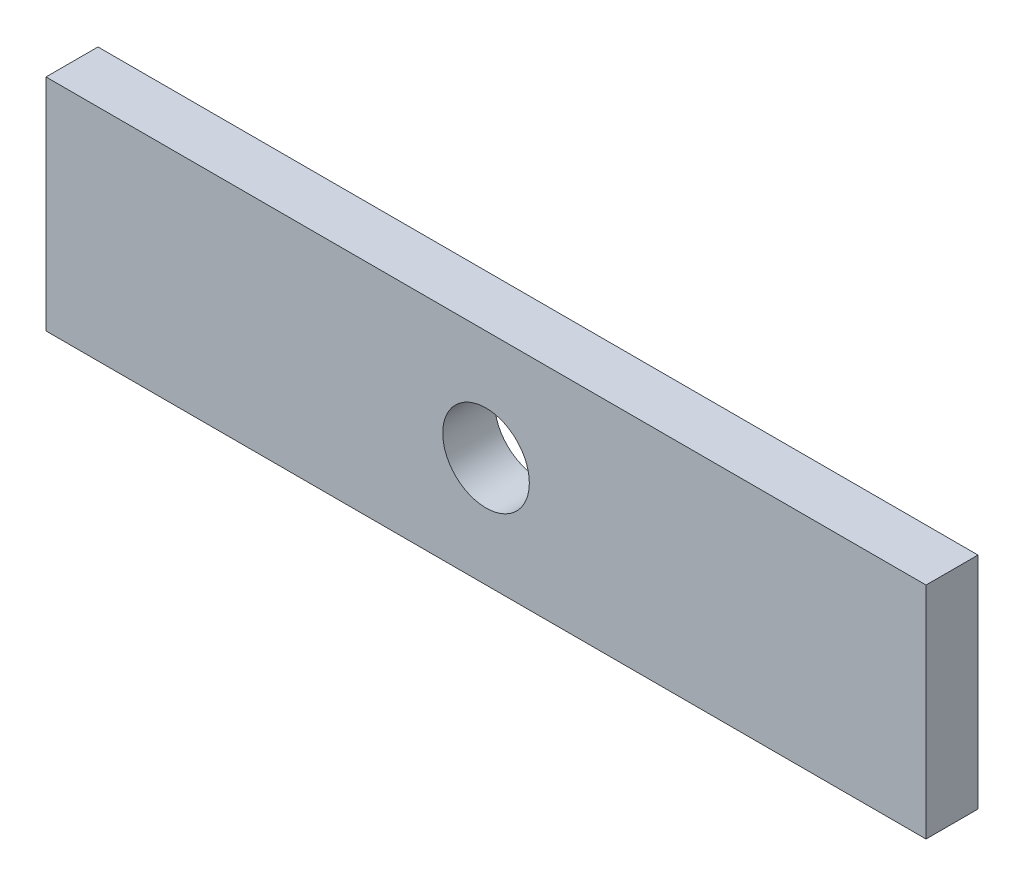
ISO-10303-21;
HEADER;
FILE_DESCRIPTION(('STEP AP214'),'2;1');
FILE_NAME('part.step','',(''),(''),'','','');
FILE_SCHEMA(('AUTOMOTIVE_DESIGN { 1 0 10303 214 1 1 1 1 }'));
ENDSEC;
DATA;
#1=APPLICATION_CONTEXT('core data for automotive mechanical design processes');
#2=APPLICATION_PROTOCOL_DEFINITION('international standard','automotive_design',2000,#1);
#3=PRODUCT_CONTEXT('',#1,'mechanical');
#4=PRODUCT('Part','Part','',(#3));
#5=PRODUCT_RELATED_PRODUCT_CATEGORY('part','',(#4));
#6=PRODUCT_DEFINITION_FORMATION('','',#4);
#7=PRODUCT_DEFINITION_CONTEXT('part definition',#1,'design');
#8=PRODUCT_DEFINITION('design','',#6,#7);
#9=PRODUCT_DEFINITION_SHAPE('','',#8);
#10=(LENGTH_UNIT() NAMED_UNIT(*) SI_UNIT(.MILLI.,.METRE.));
#11=(NAMED_UNIT(*) PLANE_ANGLE_UNIT() SI_UNIT($,.RADIAN.));
#12=(NAMED_UNIT(*) SI_UNIT($,.STERADIAN.) SOLID_ANGLE_UNIT());
#13=UNCERTAINTY_MEASURE_WITH_UNIT(LENGTH_MEASURE(1.E-05),#10,'distance_accuracy_value','');
#14=(GEOMETRIC_REPRESENTATION_CONTEXT(3) GLOBAL_UNCERTAINTY_ASSIGNED_CONTEXT((#13)) GLOBAL_UNIT_ASSIGNED_CONTEXT((#10,
#11,#12)) REPRESENTATION_CONTEXT('',''));
#15=CARTESIAN_POINT('',(0.,0.,0.));
#16=DIRECTION('',(0.,0.,1.));
#17=DIRECTION('',(1.,0.,0.));
#18=AXIS2_PLACEMENT_3D('',#15,#16,#17);
#19=CARTESIAN_POINT('',(0.,0.,3.));
#20=DIRECTION('',(0.,0.,1.));
#21=DIRECTION('',(1.,0.,0.));
#22=AXIS2_PLACEMENT_3D('',#19,#20,#21);
#23=PLANE('',#22);
#24=DIRECTION('',(0.,1.,0.));
#25=VECTOR('',#24,1.);
#26=CARTESIAN_POINT('',(25.4,6.35,3.));
#27=LINE('',#26,#25);
#28=CARTESIAN_POINT('',(25.4,-6.35,3.));
#29=VERTEX_POINT('',#28);
#30=CARTESIAN_POINT('',(25.4,6.35,3.));
#31=VERTEX_POINT('',#30);
#32=EDGE_CURVE('E96',#29,#31,#27,.T.);
#33=ORIENTED_EDGE('',*,*,#32,.T.);
#34=DIRECTION('',(-1.,0.,0.));
#35=VECTOR('',#34,1.);
#36=CARTESIAN_POINT('',(-25.4,6.35,3.));
#37=LINE('',#36,#35);
#38=CARTESIAN_POINT('',(-25.4,6.35,3.));
#39=VERTEX_POINT('',#38);
#40=EDGE_CURVE('E91',#31,#39,#37,.T.);
#41=ORIENTED_EDGE('',*,*,#40,.T.);
#42=DIRECTION('',(0.,-1.,0.));
#43=VECTOR('',#42,1.);
#44=CARTESIAN_POINT('',(-25.4,6.35,3.));
#45=LINE('',#44,#43);
#46=CARTESIAN_POINT('',(-25.4,-6.35,3.));
#47=VERTEX_POINT('',#46);
#48=EDGE_CURVE('E94',#39,#47,#45,.T.);
#49=ORIENTED_EDGE('',*,*,#48,.T.);
#50=DIRECTION('',(1.,0.,0.));
#51=VECTOR('',#50,1.);
#52=CARTESIAN_POINT('',(-25.4,-6.35,3.));
#53=LINE('',#52,#51);
#54=EDGE_CURVE('E61',#47,#29,#53,.T.);
#55=ORIENTED_EDGE('',*,*,#54,.T.);
#56=EDGE_LOOP('',(#33,#41,#49,#55));
#57=FACE_BOUND('',#56,.T.);
#58=CARTESIAN_POINT('',(0.,0.,3.));
#59=DIRECTION('',(0.,0.,1.));
#60=DIRECTION('',(1.,0.,0.));
#61=AXIS2_PLACEMENT_3D('',#58,#59,#60);
#62=CIRCLE('',#61,2.5);
#63=CARTESIAN_POINT('',(2.5,0.,3.));
#64=VERTEX_POINT('',#63);
#65=EDGE_CURVE('E117',#64,#64,#62,.T.);
#66=ORIENTED_EDGE('',*,*,#65,.F.);
#67=EDGE_LOOP('',(#66));
#68=FACE_BOUND('',#67,.T.);
#69=ADVANCED_FACE('F43',(#57,#68),#23,.T.);
#70=CARTESIAN_POINT('',(0.,0.,0.));
#71=DIRECTION('',(0.,0.,1.));
#72=DIRECTION('',(1.,0.,0.));
#73=AXIS2_PLACEMENT_3D('',#70,#71,#72);
#74=PLANE('',#73);
#75=DIRECTION('',(0.,1.,0.));
#76=VECTOR('',#75,1.);
#77=CARTESIAN_POINT('',(25.4,6.35,0.));
#78=LINE('',#77,#76);
#79=CARTESIAN_POINT('',(25.4,-6.35,0.));
#80=VERTEX_POINT('',#79);
#81=CARTESIAN_POINT('',(25.4,6.35,0.));
#82=VERTEX_POINT('',#81);
#83=EDGE_CURVE('E113',#80,#82,#78,.T.);
#84=ORIENTED_EDGE('',*,*,#83,.F.);
#85=DIRECTION('',(1.,0.,0.));
#86=VECTOR('',#85,1.);
#87=CARTESIAN_POINT('',(-25.4,-6.35,0.));
#88=LINE('',#87,#86);
#89=CARTESIAN_POINT('',(-25.4,-6.35,0.));
#90=VERTEX_POINT('',#89);
#91=EDGE_CURVE('E84',#90,#80,#88,.T.);
#92=ORIENTED_EDGE('',*,*,#91,.F.);
#93=DIRECTION('',(0.,-1.,0.));
#94=VECTOR('',#93,1.);
#95=CARTESIAN_POINT('',(-25.4,6.35,0.));
#96=LINE('',#95,#94);
#97=CARTESIAN_POINT('',(-25.4,6.35,0.));
#98=VERTEX_POINT('',#97);
#99=EDGE_CURVE('E78',#98,#90,#96,.T.);
#100=ORIENTED_EDGE('',*,*,#99,.F.);
#101=DIRECTION('',(-1.,0.,0.));
#102=VECTOR('',#101,1.);
#103=CARTESIAN_POINT('',(-25.4,6.35,0.));
#104=LINE('',#103,#102);
#105=EDGE_CURVE('E101',#82,#98,#104,.T.);
#106=ORIENTED_EDGE('',*,*,#105,.F.);
#107=EDGE_LOOP('',(#84,#92,#100,#106));
#108=FACE_BOUND('',#107,.T.);
#109=CARTESIAN_POINT('',(0.,0.,0.));
#110=DIRECTION('',(0.,0.,1.));
#111=DIRECTION('',(1.,0.,0.));
#112=AXIS2_PLACEMENT_3D('',#109,#110,#111);
#113=CIRCLE('',#112,2.5);
#114=CARTESIAN_POINT('',(2.5,0.,0.));
#115=VERTEX_POINT('',#114);
#116=EDGE_CURVE('E137',#115,#115,#113,.T.);
#117=ORIENTED_EDGE('',*,*,#116,.T.);
#118=EDGE_LOOP('',(#117));
#119=FACE_BOUND('',#118,.T.);
#120=ADVANCED_FACE('F131',(#108,#119),#74,.F.);
#121=CARTESIAN_POINT('',(25.4,6.35,3.));
#122=DIRECTION('',(-1.,0.,0.));
#123=DIRECTION('',(0.,-1.,0.));
#124=AXIS2_PLACEMENT_3D('',#121,#122,#123);
#125=PLANE('',#124);
#126=ORIENTED_EDGE('',*,*,#83,.T.);
#127=DIRECTION('',(0.,0.,-1.));
#128=VECTOR('',#127,1.);
#129=CARTESIAN_POINT('',(25.4,6.35,3.));
#130=LINE('',#129,#128);
#131=EDGE_CURVE('E11',#31,#82,#130,.T.);
#132=ORIENTED_EDGE('',*,*,#131,.F.);
#133=ORIENTED_EDGE('',*,*,#32,.F.);
#134=DIRECTION('',(0.,0.,-1.));
#135=VECTOR('',#134,1.);
#136=CARTESIAN_POINT('',(25.4,-6.35,3.));
#137=LINE('',#136,#135);
#138=EDGE_CURVE('E109',#29,#80,#137,.T.);
#139=ORIENTED_EDGE('',*,*,#138,.T.);
#140=EDGE_LOOP('',(#126,#132,#133,#139));
#141=FACE_BOUND('',#140,.T.);
#142=ADVANCED_FACE('F45',(#141),#125,.F.);
#143=CARTESIAN_POINT('',(-25.4,6.35,3.));
#144=DIRECTION('',(0.,-1.,0.));
#145=DIRECTION('',(0.,0.,-1.));
#146=AXIS2_PLACEMENT_3D('',#143,#144,#145);
#147=PLANE('',#146);
#148=ORIENTED_EDGE('',*,*,#105,.T.);
#149=DIRECTION('',(0.,0.,-1.));
#150=VECTOR('',#149,1.);
#151=CARTESIAN_POINT('',(-25.4,6.35,3.));
#152=LINE('',#151,#150);
#153=EDGE_CURVE('E53',#39,#98,#152,.T.);
#154=ORIENTED_EDGE('',*,*,#153,.F.);
#155=ORIENTED_EDGE('',*,*,#40,.F.);
#156=ORIENTED_EDGE('',*,*,#131,.T.);
#157=EDGE_LOOP('',(#148,#154,#155,#156));
#158=FACE_BOUND('',#157,.T.);
#159=ADVANCED_FACE('F100',(#158),#147,.F.);
#160=CARTESIAN_POINT('',(-25.4,6.35,3.));
#161=DIRECTION('',(1.,0.,0.));
#162=DIRECTION('',(0.,1.,0.));
#163=AXIS2_PLACEMENT_3D('',#160,#161,#162);
#164=PLANE('',#163);
#165=ORIENTED_EDGE('',*,*,#99,.T.);
#166=DIRECTION('',(0.,0.,-1.));
#167=VECTOR('',#166,1.);
#168=CARTESIAN_POINT('',(-25.4,-6.35,3.));
#169=LINE('',#168,#167);
#170=EDGE_CURVE('E103',#47,#90,#169,.T.);
#171=ORIENTED_EDGE('',*,*,#170,.F.);
#172=ORIENTED_EDGE('',*,*,#48,.F.);
#173=ORIENTED_EDGE('',*,*,#153,.T.);
#174=EDGE_LOOP('',(#165,#171,#172,#173));
#175=FACE_BOUND('',#174,.T.);
#176=ADVANCED_FACE('F104',(#175),#164,.F.);
#177=CARTESIAN_POINT('',(-25.4,-6.35,3.));
#178=DIRECTION('',(0.,1.,0.));
#179=DIRECTION('',(0.,0.,1.));
#180=AXIS2_PLACEMENT_3D('',#177,#178,#179);
#181=PLANE('',#180);
#182=ORIENTED_EDGE('',*,*,#91,.T.);
#183=ORIENTED_EDGE('',*,*,#138,.F.);
#184=ORIENTED_EDGE('',*,*,#54,.F.);
#185=ORIENTED_EDGE('',*,*,#170,.T.);
#186=EDGE_LOOP('',(#182,#183,#184,#185));
#187=FACE_BOUND('',#186,.T.);
#188=ADVANCED_FACE('F128',(#187),#181,.F.);
#189=CARTESIAN_POINT('',(0.,0.,3.));
#190=DIRECTION('',(0.,0.,-1.));
#191=DIRECTION('',(-1.,0.,0.));
#192=AXIS2_PLACEMENT_3D('',#189,#190,#191);
#193=CYLINDRICAL_SURFACE('',#192,2.5);
#194=ORIENTED_EDGE('',*,*,#65,.T.);
#195=EDGE_LOOP('',(#194));
#196=FACE_BOUND('',#195,.T.);
#197=ORIENTED_EDGE('',*,*,#116,.F.);
#198=EDGE_LOOP('',(#197));
#199=FACE_BOUND('',#198,.T.);
#200=ADVANCED_FACE('F146',(#196,#199),#193,.F.);
#201=CLOSED_SHELL('',(#69,#120,#142,#159,#176,#188,#200));
#202=MANIFOLD_SOLID_BREP('B2',#201);
#203=ADVANCED_BREP_SHAPE_REPRESENTATION('',(#18,#202),#14);
#204=SHAPE_DEFINITION_REPRESENTATION(#9,#203);
ENDSEC;
END-ISO-10303-21;
